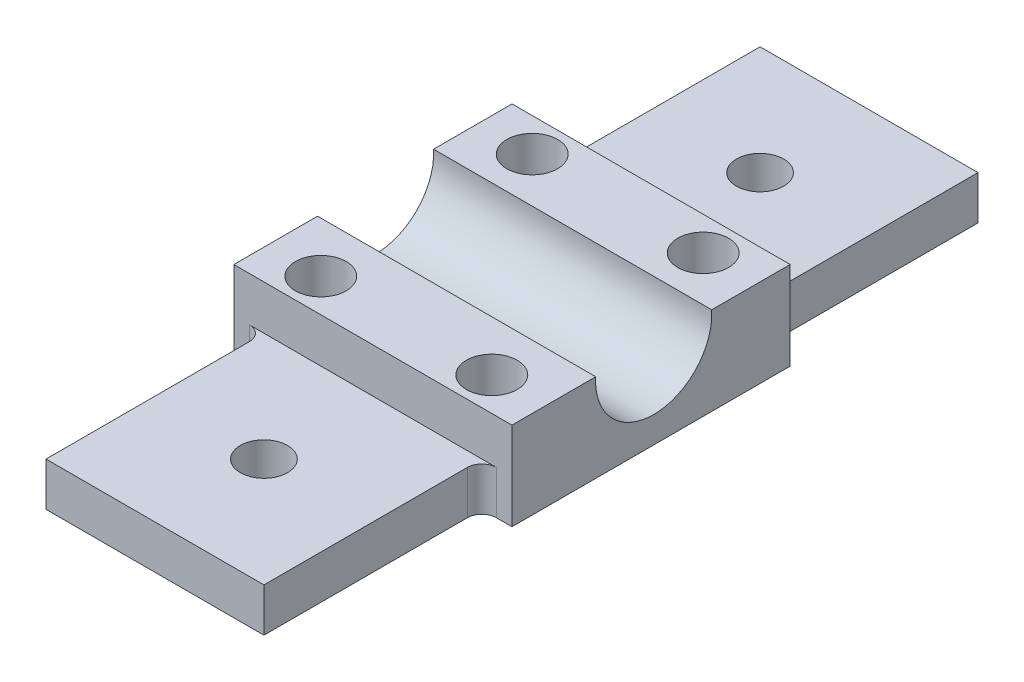
ISO-10303-21;
HEADER;
FILE_DESCRIPTION(('STEP AP214'),'2;1');
FILE_NAME('part.step','',(''),(''),'','','');
FILE_SCHEMA(('AUTOMOTIVE_DESIGN { 1 0 10303 214 1 1 1 1 }'));
ENDSEC;
DATA;
#1=APPLICATION_CONTEXT('core data for automotive mechanical design processes');
#2=APPLICATION_PROTOCOL_DEFINITION('international standard','automotive_design',2000,#1);
#3=PRODUCT_CONTEXT('',#1,'mechanical');
#4=PRODUCT('Part','Part','',(#3));
#5=PRODUCT_RELATED_PRODUCT_CATEGORY('part','',(#4));
#6=PRODUCT_DEFINITION_FORMATION('','',#4);
#7=PRODUCT_DEFINITION_CONTEXT('part definition',#1,'design');
#8=PRODUCT_DEFINITION('design','',#6,#7);
#9=PRODUCT_DEFINITION_SHAPE('','',#8);
#10=(LENGTH_UNIT() NAMED_UNIT(*) SI_UNIT(.MILLI.,.METRE.));
#11=(NAMED_UNIT(*) PLANE_ANGLE_UNIT() SI_UNIT($,.RADIAN.));
#12=(NAMED_UNIT(*) SI_UNIT($,.STERADIAN.) SOLID_ANGLE_UNIT());
#13=UNCERTAINTY_MEASURE_WITH_UNIT(LENGTH_MEASURE(1.E-05),#10,'distance_accuracy_value','');
#14=(GEOMETRIC_REPRESENTATION_CONTEXT(3) GLOBAL_UNCERTAINTY_ASSIGNED_CONTEXT((#13)) GLOBAL_UNIT_ASSIGNED_CONTEXT((#10,
#11,#12)) REPRESENTATION_CONTEXT('',''));
#15=CARTESIAN_POINT('',(0.,0.,0.));
#16=DIRECTION('',(0.,0.,1.));
#17=DIRECTION('',(1.,0.,0.));
#18=AXIS2_PLACEMENT_3D('',#15,#16,#17);
#19=CARTESIAN_POINT('',(-19.145,12.12,19.15));
#20=DIRECTION('',(0.,0.,-1.));
#21=DIRECTION('',(-1.,0.,0.));
#22=AXIS2_PLACEMENT_3D('',#19,#20,#21);
#23=PLANE('',#22);
#24=DIRECTION('',(-1.,0.,0.));
#25=VECTOR('',#24,1.);
#26=CARTESIAN_POINT('',(15.,6.,19.15));
#27=LINE('',#26,#25);
#28=CARTESIAN_POINT('',(17.,6.,19.15));
#29=VERTEX_POINT('',#28);
#30=CARTESIAN_POINT('',(-17.,6.,19.15));
#31=VERTEX_POINT('',#30);
#32=EDGE_CURVE('E190',#29,#31,#27,.T.);
#33=ORIENTED_EDGE('',*,*,#32,.F.);
#34=DIRECTION('',(0.,-1.,0.));
#35=VECTOR('',#34,1.);
#36=CARTESIAN_POINT('',(17.,0.,19.15));
#37=LINE('',#36,#35);
#38=CARTESIAN_POINT('',(17.,0.,19.15));
#39=VERTEX_POINT('',#38);
#40=EDGE_CURVE('E312',#29,#39,#37,.T.);
#41=ORIENTED_EDGE('',*,*,#40,.T.);
#42=DIRECTION('',(1.,0.,0.));
#43=VECTOR('',#42,1.);
#44=CARTESIAN_POINT('',(-19.145,0.,19.15));
#45=LINE('',#44,#43);
#46=CARTESIAN_POINT('',(19.145,0.,19.15));
#47=VERTEX_POINT('',#46);
#48=EDGE_CURVE('E294',#39,#47,#45,.T.);
#49=ORIENTED_EDGE('',*,*,#48,.T.);
#50=DIRECTION('',(0.,-1.,0.));
#51=VECTOR('',#50,1.);
#52=CARTESIAN_POINT('',(19.145,12.12,19.15));
#53=LINE('',#52,#51);
#54=CARTESIAN_POINT('',(19.145,12.12,19.15));
#55=VERTEX_POINT('',#54);
#56=EDGE_CURVE('E285',#55,#47,#53,.T.);
#57=ORIENTED_EDGE('',*,*,#56,.F.);
#58=DIRECTION('',(1.,0.,0.));
#59=VECTOR('',#58,1.);
#60=CARTESIAN_POINT('',(-19.145,12.12,19.15));
#61=LINE('',#60,#59);
#62=CARTESIAN_POINT('',(-19.145,12.12,19.15));
#63=VERTEX_POINT('',#62);
#64=EDGE_CURVE('E283',#63,#55,#61,.T.);
#65=ORIENTED_EDGE('',*,*,#64,.F.);
#66=DIRECTION('',(0.,-1.,0.));
#67=VECTOR('',#66,1.);
#68=CARTESIAN_POINT('',(-19.145,12.12,19.15));
#69=LINE('',#68,#67);
#70=CARTESIAN_POINT('',(-19.145,0.,19.15));
#71=VERTEX_POINT('',#70);
#72=EDGE_CURVE('E300',#63,#71,#69,.T.);
#73=ORIENTED_EDGE('',*,*,#72,.T.);
#74=CARTESIAN_POINT('',(-17.,0.,19.15));
#75=VERTEX_POINT('',#74);
#76=EDGE_CURVE('E295',#71,#75,#45,.T.);
#77=ORIENTED_EDGE('',*,*,#76,.T.);
#78=DIRECTION('',(0.,-1.,0.));
#79=VECTOR('',#78,1.);
#80=CARTESIAN_POINT('',(-17.,6.,19.15));
#81=LINE('',#80,#79);
#82=EDGE_CURVE('E309',#75,#31,#81,.F.);
#83=ORIENTED_EDGE('',*,*,#82,.T.);
#84=EDGE_LOOP('',(#33,#41,#49,#57,#65,#73,#77,#83));
#85=FACE_BOUND('',#84,.T.);
#86=ADVANCED_FACE('F43',(#85),#23,.F.);
#87=CARTESIAN_POINT('',(-19.145,12.12,-19.15));
#88=DIRECTION('',(0.,0.,1.));
#89=DIRECTION('',(1.,0.,0.));
#90=AXIS2_PLACEMENT_3D('',#87,#88,#89);
#91=PLANE('',#90);
#92=DIRECTION('',(-1.,0.,0.));
#93=VECTOR('',#92,1.);
#94=CARTESIAN_POINT('',(-19.145,0.,-19.15));
#95=LINE('',#94,#93);
#96=CARTESIAN_POINT('',(19.145,0.,-19.15));
#97=VERTEX_POINT('',#96);
#98=CARTESIAN_POINT('',(17.,0.,-19.15));
#99=VERTEX_POINT('',#98);
#100=EDGE_CURVE('E289',#97,#99,#95,.T.);
#101=ORIENTED_EDGE('',*,*,#100,.T.);
#102=DIRECTION('',(0.,-1.,0.));
#103=VECTOR('',#102,1.);
#104=CARTESIAN_POINT('',(17.,12.12,-19.15));
#105=LINE('',#104,#103);
#106=CARTESIAN_POINT('',(17.,6.,-19.15));
#107=VERTEX_POINT('',#106);
#108=EDGE_CURVE('E322',#99,#107,#105,.F.);
#109=ORIENTED_EDGE('',*,*,#108,.T.);
#110=DIRECTION('',(-1.,0.,0.));
#111=VECTOR('',#110,1.);
#112=CARTESIAN_POINT('',(15.,6.,-19.15));
#113=LINE('',#112,#111);
#114=CARTESIAN_POINT('',(-17.,6.,-19.15));
#115=VERTEX_POINT('',#114);
#116=EDGE_CURVE('E219',#107,#115,#113,.T.);
#117=ORIENTED_EDGE('',*,*,#116,.T.);
#118=DIRECTION('',(0.,-1.,0.));
#119=VECTOR('',#118,1.);
#120=CARTESIAN_POINT('',(-17.,12.12,-19.15));
#121=LINE('',#120,#119);
#122=CARTESIAN_POINT('',(-17.,0.,-19.15));
#123=VERTEX_POINT('',#122);
#124=EDGE_CURVE('E319',#115,#123,#121,.T.);
#125=ORIENTED_EDGE('',*,*,#124,.T.);
#126=CARTESIAN_POINT('',(-19.145,0.,-19.15));
#127=VERTEX_POINT('',#126);
#128=EDGE_CURVE('E288',#123,#127,#95,.T.);
#129=ORIENTED_EDGE('',*,*,#128,.T.);
#130=DIRECTION('',(0.,-1.,0.));
#131=VECTOR('',#130,1.);
#132=CARTESIAN_POINT('',(-19.145,12.12,-19.15));
#133=LINE('',#132,#131);
#134=CARTESIAN_POINT('',(-19.145,12.12,-19.15));
#135=VERTEX_POINT('',#134);
#136=EDGE_CURVE('E303',#135,#127,#133,.T.);
#137=ORIENTED_EDGE('',*,*,#136,.F.);
#138=DIRECTION('',(-1.,0.,0.));
#139=VECTOR('',#138,1.);
#140=CARTESIAN_POINT('',(-19.145,12.12,-19.15));
#141=LINE('',#140,#139);
#142=CARTESIAN_POINT('',(19.145,12.12,-19.15));
#143=VERTEX_POINT('',#142);
#144=EDGE_CURVE('E276',#143,#135,#141,.T.);
#145=ORIENTED_EDGE('',*,*,#144,.F.);
#146=DIRECTION('',(0.,-1.,0.));
#147=VECTOR('',#146,1.);
#148=CARTESIAN_POINT('',(19.145,12.12,-19.15));
#149=LINE('',#148,#147);
#150=EDGE_CURVE('E306',#143,#97,#149,.T.);
#151=ORIENTED_EDGE('',*,*,#150,.T.);
#152=EDGE_LOOP('',(#101,#109,#117,#125,#129,#137,#145,#151));
#153=FACE_BOUND('',#152,.T.);
#154=ADVANCED_FACE('F363',(#153),#91,.F.);
#155=CARTESIAN_POINT('',(0.,12.12,0.));
#156=DIRECTION('',(0.,1.,0.));
#157=DIRECTION('',(0.,0.,1.));
#158=AXIS2_PLACEMENT_3D('',#155,#156,#157);
#159=PLANE('',#158);
#160=CARTESIAN_POINT('',(-11.77,12.12,14.55));
#161=DIRECTION('',(0.,1.,0.));
#162=DIRECTION('',(0.,0.,1.));
#163=AXIS2_PLACEMENT_3D('',#160,#161,#162);
#164=CIRCLE('',#163,3.49999999999999);
#165=CARTESIAN_POINT('',(-11.77,12.12,18.05));
#166=VERTEX_POINT('',#165);
#167=EDGE_CURVE('E250',#166,#166,#164,.T.);
#168=ORIENTED_EDGE('',*,*,#167,.F.);
#169=EDGE_LOOP('',(#168));
#170=FACE_BOUND('',#169,.T.);
#171=CARTESIAN_POINT('',(11.77,12.12,14.55));
#172=DIRECTION('',(0.,1.,0.));
#173=DIRECTION('',(0.,0.,1.));
#174=AXIS2_PLACEMENT_3D('',#171,#172,#173);
#175=CIRCLE('',#174,3.49999999999999);
#176=CARTESIAN_POINT('',(11.77,12.12,18.05));
#177=VERTEX_POINT('',#176);
#178=EDGE_CURVE('E256',#177,#177,#175,.T.);
#179=ORIENTED_EDGE('',*,*,#178,.F.);
#180=EDGE_LOOP('',(#179));
#181=FACE_BOUND('',#180,.T.);
#182=DIRECTION('',(1.,0.,0.));
#183=VECTOR('',#182,1.);
#184=CARTESIAN_POINT('',(-19.145,12.12,7.62052552667431));
#185=LINE('',#184,#183);
#186=CARTESIAN_POINT('',(-19.145,12.12,7.62052552667431));
#187=VERTEX_POINT('',#186);
#188=CARTESIAN_POINT('',(19.145,12.12,7.62052552667431));
#189=VERTEX_POINT('',#188);
#190=EDGE_CURVE('E268',#187,#189,#185,.T.);
#191=ORIENTED_EDGE('',*,*,#190,.F.);
#192=DIRECTION('',(0.,0.,1.));
#193=VECTOR('',#192,1.);
#194=CARTESIAN_POINT('',(-19.145,12.12,-19.15));
#195=LINE('',#194,#193);
#196=EDGE_CURVE('E279',#187,#63,#195,.T.);
#197=ORIENTED_EDGE('',*,*,#196,.T.);
#198=ORIENTED_EDGE('',*,*,#64,.T.);
#199=DIRECTION('',(0.,0.,-1.));
#200=VECTOR('',#199,1.);
#201=CARTESIAN_POINT('',(19.145,12.12,-19.15));
#202=LINE('',#201,#200);
#203=EDGE_CURVE('E273',#55,#189,#202,.T.);
#204=ORIENTED_EDGE('',*,*,#203,.T.);
#205=EDGE_LOOP('',(#191,#197,#198,#204));
#206=FACE_BOUND('',#205,.T.);
#207=ADVANCED_FACE('F412',(#170,#181,#206),#159,.T.);
#208=CARTESIAN_POINT('',(19.145,12.12,-19.15));
#209=DIRECTION('',(-1.,0.,0.));
#210=DIRECTION('',(0.,0.,1.));
#211=AXIS2_PLACEMENT_3D('',#208,#209,#210);
#212=PLANE('',#211);
#213=CARTESIAN_POINT('',(19.145,12.12,-8.348193895997));
#214=VERTEX_POINT('',#213);
#215=EDGE_CURVE('E277',#214,#143,#202,.T.);
#216=ORIENTED_EDGE('',*,*,#215,.F.);
#217=CARTESIAN_POINT('',(19.145,11.62,-0.363834184661345));
#218=DIRECTION('',(1.,0.,0.));
#219=DIRECTION('',(0.,0.,-1.));
#220=AXIS2_PLACEMENT_3D('',#217,#218,#219);
#221=CIRCLE('',#220,8.);
#222=EDGE_CURVE('E262',#189,#214,#221,.T.);
#223=ORIENTED_EDGE('',*,*,#222,.F.);
#224=ORIENTED_EDGE('',*,*,#203,.F.);
#225=ORIENTED_EDGE('',*,*,#56,.T.);
#226=DIRECTION('',(0.,0.,-1.));
#227=VECTOR('',#226,1.);
#228=CARTESIAN_POINT('',(19.145,0.,-19.15));
#229=LINE('',#228,#227);
#230=EDGE_CURVE('E270',#47,#97,#229,.T.);
#231=ORIENTED_EDGE('',*,*,#230,.T.);
#232=ORIENTED_EDGE('',*,*,#150,.F.);
#233=EDGE_LOOP('',(#216,#223,#224,#225,#231,#232));
#234=FACE_BOUND('',#233,.T.);
#235=ADVANCED_FACE('F389',(#234),#212,.F.);
#236=CARTESIAN_POINT('',(-19.145,12.12,-19.15));
#237=DIRECTION('',(1.,0.,0.));
#238=DIRECTION('',(0.,0.,-1.));
#239=AXIS2_PLACEMENT_3D('',#236,#237,#238);
#240=PLANE('',#239);
#241=ORIENTED_EDGE('',*,*,#196,.F.);
#242=CARTESIAN_POINT('',(-19.145,11.62,-0.363834184661345));
#243=DIRECTION('',(1.,0.,0.));
#244=DIRECTION('',(0.,0.,-1.));
#245=AXIS2_PLACEMENT_3D('',#242,#243,#244);
#246=CIRCLE('',#245,8.);
#247=CARTESIAN_POINT('',(-19.145,12.12,-8.348193895997));
#248=VERTEX_POINT('',#247);
#249=EDGE_CURVE('E263',#187,#248,#246,.T.);
#250=ORIENTED_EDGE('',*,*,#249,.T.);
#251=EDGE_CURVE('E280',#135,#248,#195,.T.);
#252=ORIENTED_EDGE('',*,*,#251,.F.);
#253=ORIENTED_EDGE('',*,*,#136,.T.);
#254=DIRECTION('',(0.,0.,1.));
#255=VECTOR('',#254,1.);
#256=CARTESIAN_POINT('',(-19.145,0.,-19.15));
#257=LINE('',#256,#255);
#258=EDGE_CURVE('E292',#127,#71,#257,.T.);
#259=ORIENTED_EDGE('',*,*,#258,.T.);
#260=ORIENTED_EDGE('',*,*,#72,.F.);
#261=EDGE_LOOP('',(#241,#250,#252,#253,#259,#260));
#262=FACE_BOUND('',#261,.T.);
#263=ADVANCED_FACE('F359',(#262),#240,.F.);
#264=CARTESIAN_POINT('',(-11.77,12.12,-14.55));
#265=DIRECTION('',(0.,1.,0.));
#266=DIRECTION('',(0.,0.,1.));
#267=AXIS2_PLACEMENT_3D('',#264,#265,#266);
#268=CIRCLE('',#267,3.49999999999999);
#269=CARTESIAN_POINT('',(-11.77,12.12,-11.05));
#270=VERTEX_POINT('',#269);
#271=EDGE_CURVE('E236',#270,#270,#268,.T.);
#272=ORIENTED_EDGE('',*,*,#271,.F.);
#273=EDGE_LOOP('',(#272));
#274=FACE_BOUND('',#273,.T.);
#275=CARTESIAN_POINT('',(11.77,12.12,-14.55));
#276=DIRECTION('',(0.,1.,0.));
#277=DIRECTION('',(0.,0.,1.));
#278=AXIS2_PLACEMENT_3D('',#275,#276,#277);
#279=CIRCLE('',#278,3.49999999999999);
#280=CARTESIAN_POINT('',(11.77,12.12,-11.05));
#281=VERTEX_POINT('',#280);
#282=EDGE_CURVE('E244',#281,#281,#279,.T.);
#283=ORIENTED_EDGE('',*,*,#282,.F.);
#284=EDGE_LOOP('',(#283));
#285=FACE_BOUND('',#284,.T.);
#286=DIRECTION('',(1.,0.,0.));
#287=VECTOR('',#286,1.);
#288=CARTESIAN_POINT('',(-19.145,12.12,-8.348193895997));
#289=LINE('',#288,#287);
#290=EDGE_CURVE('E266',#248,#214,#289,.T.);
#291=ORIENTED_EDGE('',*,*,#290,.T.);
#292=ORIENTED_EDGE('',*,*,#215,.T.);
#293=ORIENTED_EDGE('',*,*,#144,.T.);
#294=ORIENTED_EDGE('',*,*,#251,.T.);
#295=EDGE_LOOP('',(#291,#292,#293,#294));
#296=FACE_BOUND('',#295,.T.);
#297=ADVANCED_FACE('F418',(#274,#285,#296),#159,.T.);
#298=CARTESIAN_POINT('',(0.,0.,0.));
#299=DIRECTION('',(0.,1.,0.));
#300=DIRECTION('',(0.,0.,1.));
#301=AXIS2_PLACEMENT_3D('',#298,#299,#300);
#302=PLANE('',#301);
#303=CARTESIAN_POINT('',(-11.77,0.,-14.55));
#304=DIRECTION('',(0.,1.,0.));
#305=DIRECTION('',(0.,0.,1.));
#306=AXIS2_PLACEMENT_3D('',#303,#304,#305);
#307=CIRCLE('',#306,3.49999999999999);
#308=CARTESIAN_POINT('',(-11.77,0.,-11.05));
#309=VERTEX_POINT('',#308);
#310=EDGE_CURVE('E241',#309,#309,#307,.T.);
#311=ORIENTED_EDGE('',*,*,#310,.T.);
#312=EDGE_LOOP('',(#311));
#313=FACE_BOUND('',#312,.T.);
#314=CARTESIAN_POINT('',(11.77,0.,-14.55));
#315=DIRECTION('',(0.,1.,0.));
#316=DIRECTION('',(0.,0.,1.));
#317=AXIS2_PLACEMENT_3D('',#314,#315,#316);
#318=CIRCLE('',#317,3.49999999999999);
#319=CARTESIAN_POINT('',(11.77,0.,-11.05));
#320=VERTEX_POINT('',#319);
#321=EDGE_CURVE('E247',#320,#320,#318,.T.);
#322=ORIENTED_EDGE('',*,*,#321,.T.);
#323=EDGE_LOOP('',(#322));
#324=FACE_BOUND('',#323,.T.);
#325=CARTESIAN_POINT('',(-11.77,0.,14.55));
#326=DIRECTION('',(0.,1.,0.));
#327=DIRECTION('',(0.,0.,1.));
#328=AXIS2_PLACEMENT_3D('',#325,#326,#327);
#329=CIRCLE('',#328,3.49999999999999);
#330=CARTESIAN_POINT('',(-11.77,0.,18.05));
#331=VERTEX_POINT('',#330);
#332=EDGE_CURVE('E253',#331,#331,#329,.T.);
#333=ORIENTED_EDGE('',*,*,#332,.T.);
#334=EDGE_LOOP('',(#333));
#335=FACE_BOUND('',#334,.T.);
#336=CARTESIAN_POINT('',(11.77,0.,14.55));
#337=DIRECTION('',(0.,1.,0.));
#338=DIRECTION('',(0.,0.,1.));
#339=AXIS2_PLACEMENT_3D('',#336,#337,#338);
#340=CIRCLE('',#339,3.49999999999999);
#341=CARTESIAN_POINT('',(11.77,0.,18.05));
#342=VERTEX_POINT('',#341);
#343=EDGE_CURVE('E259',#342,#342,#340,.T.);
#344=ORIENTED_EDGE('',*,*,#343,.T.);
#345=EDGE_LOOP('',(#344));
#346=FACE_BOUND('',#345,.T.);
#347=ORIENTED_EDGE('',*,*,#230,.F.);
#348=ORIENTED_EDGE('',*,*,#48,.F.);
#349=CARTESIAN_POINT('',(17.,0.,21.15));
#350=DIRECTION('',(0.,1.,0.));
#351=DIRECTION('',(0.,0.,1.));
#352=AXIS2_PLACEMENT_3D('',#349,#350,#351);
#353=CIRCLE('',#352,2.);
#354=CARTESIAN_POINT('',(15.,0.,21.15));
#355=VERTEX_POINT('',#354);
#356=EDGE_CURVE('E329',#39,#355,#353,.T.);
#357=ORIENTED_EDGE('',*,*,#356,.T.);
#358=DIRECTION('',(0.,0.,-1.));
#359=VECTOR('',#358,1.);
#360=CARTESIAN_POINT('',(15.,0.,19.15));
#361=LINE('',#360,#359);
#362=CARTESIAN_POINT('',(15.,0.,49.15));
#363=VERTEX_POINT('',#362);
#364=EDGE_CURVE('E204',#363,#355,#361,.T.);
#365=ORIENTED_EDGE('',*,*,#364,.F.);
#366=DIRECTION('',(1.,0.,0.));
#367=VECTOR('',#366,1.);
#368=CARTESIAN_POINT('',(15.,0.,49.15));
#369=LINE('',#368,#367);
#370=CARTESIAN_POINT('',(-15.,0.,49.15));
#371=VERTEX_POINT('',#370);
#372=EDGE_CURVE('E185',#371,#363,#369,.T.);
#373=ORIENTED_EDGE('',*,*,#372,.F.);
#374=DIRECTION('',(0.,0.,1.));
#375=VECTOR('',#374,1.);
#376=CARTESIAN_POINT('',(-15.,0.,19.15));
#377=LINE('',#376,#375);
#378=CARTESIAN_POINT('',(-15.,0.,21.15));
#379=VERTEX_POINT('',#378);
#380=EDGE_CURVE('E195',#379,#371,#377,.T.);
#381=ORIENTED_EDGE('',*,*,#380,.F.);
#382=CARTESIAN_POINT('',(-17.,0.,21.15));
#383=DIRECTION('',(0.,1.,0.));
#384=DIRECTION('',(0.,0.,1.));
#385=AXIS2_PLACEMENT_3D('',#382,#383,#384);
#386=CIRCLE('',#385,2.);
#387=EDGE_CURVE('E337',#379,#75,#386,.T.);
#388=ORIENTED_EDGE('',*,*,#387,.T.);
#389=ORIENTED_EDGE('',*,*,#76,.F.);
#390=ORIENTED_EDGE('',*,*,#258,.F.);
#391=ORIENTED_EDGE('',*,*,#128,.F.);
#392=CARTESIAN_POINT('',(-17.,0.,-21.15));
#393=DIRECTION('',(0.,1.,0.));
#394=DIRECTION('',(0.,0.,1.));
#395=AXIS2_PLACEMENT_3D('',#392,#393,#394);
#396=CIRCLE('',#395,2.);
#397=CARTESIAN_POINT('',(-15.,0.,-21.15));
#398=VERTEX_POINT('',#397);
#399=EDGE_CURVE('E51',#123,#398,#396,.T.);
#400=ORIENTED_EDGE('',*,*,#399,.T.);
#401=DIRECTION('',(0.,0.,-1.));
#402=VECTOR('',#401,1.);
#403=CARTESIAN_POINT('',(-15.,0.,-19.15));
#404=LINE('',#403,#402);
#405=CARTESIAN_POINT('',(-15.,0.,-49.15));
#406=VERTEX_POINT('',#405);
#407=EDGE_CURVE('E230',#398,#406,#404,.T.);
#408=ORIENTED_EDGE('',*,*,#407,.T.);
#409=DIRECTION('',(1.,0.,0.));
#410=VECTOR('',#409,1.);
#411=CARTESIAN_POINT('',(15.,0.,-49.15));
#412=LINE('',#411,#410);
#413=CARTESIAN_POINT('',(15.,0.,-49.15));
#414=VERTEX_POINT('',#413);
#415=EDGE_CURVE('E220',#406,#414,#412,.T.);
#416=ORIENTED_EDGE('',*,*,#415,.T.);
#417=DIRECTION('',(0.,0.,1.));
#418=VECTOR('',#417,1.);
#419=CARTESIAN_POINT('',(15.,0.,-19.15));
#420=LINE('',#419,#418);
#421=CARTESIAN_POINT('',(15.,0.,-21.15));
#422=VERTEX_POINT('',#421);
#423=EDGE_CURVE('E213',#414,#422,#420,.T.);
#424=ORIENTED_EDGE('',*,*,#423,.T.);
#425=CARTESIAN_POINT('',(17.,0.,-21.15));
#426=DIRECTION('',(0.,1.,0.));
#427=DIRECTION('',(0.,0.,1.));
#428=AXIS2_PLACEMENT_3D('',#425,#426,#427);
#429=CIRCLE('',#428,2.);
#430=EDGE_CURVE('E333',#422,#99,#429,.T.);
#431=ORIENTED_EDGE('',*,*,#430,.T.);
#432=ORIENTED_EDGE('',*,*,#100,.F.);
#433=EDGE_LOOP('',(#347,#348,#357,#365,#373,#381,#388,#389,#390,#391,#400,#408,#416,#424,#431,#432));
#434=FACE_BOUND('',#433,.T.);
#435=CARTESIAN_POINT('',(0.,0.,-34.15));
#436=DIRECTION('',(0.,-1.,0.));
#437=DIRECTION('',(0.,0.,-1.));
#438=AXIS2_PLACEMENT_3D('',#435,#436,#437);
#439=CIRCLE('',#438,3.25);
#440=CARTESIAN_POINT('',(0.,0.,-37.4));
#441=VERTEX_POINT('',#440);
#442=EDGE_CURVE('E208',#441,#441,#439,.T.);
#443=ORIENTED_EDGE('',*,*,#442,.F.);
#444=EDGE_LOOP('',(#443));
#445=FACE_BOUND('',#444,.T.);
#446=CARTESIAN_POINT('',(0.,0.,34.15));
#447=DIRECTION('',(0.,1.,0.));
#448=DIRECTION('',(0.,0.,1.));
#449=AXIS2_PLACEMENT_3D('',#446,#447,#448);
#450=CIRCLE('',#449,3.25);
#451=CARTESIAN_POINT('',(0.,0.,37.4));
#452=VERTEX_POINT('',#451);
#453=EDGE_CURVE('E199',#452,#452,#450,.T.);
#454=ORIENTED_EDGE('',*,*,#453,.T.);
#455=EDGE_LOOP('',(#454));
#456=FACE_BOUND('',#455,.T.);
#457=ADVANCED_FACE('F350',(#313,#324,#335,#346,#434,#445,#456),#302,.F.);
#458=CARTESIAN_POINT('',(-19.145,11.62,-0.363834184661345));
#459=DIRECTION('',(1.,0.,0.));
#460=DIRECTION('',(0.,0.,-1.));
#461=AXIS2_PLACEMENT_3D('',#458,#459,#460);
#462=CYLINDRICAL_SURFACE('',#461,8.);
#463=ORIENTED_EDGE('',*,*,#222,.T.);
#464=ORIENTED_EDGE('',*,*,#290,.F.);
#465=ORIENTED_EDGE('',*,*,#249,.F.);
#466=ORIENTED_EDGE('',*,*,#190,.T.);
#467=EDGE_LOOP('',(#463,#464,#465,#466));
#468=FACE_BOUND('',#467,.T.);
#469=ADVANCED_FACE('F437',(#468),#462,.F.);
#470=CARTESIAN_POINT('',(11.77,12.12,14.55));
#471=DIRECTION('',(0.,1.,0.));
#472=DIRECTION('',(0.,0.,1.));
#473=AXIS2_PLACEMENT_3D('',#470,#471,#472);
#474=CYLINDRICAL_SURFACE('',#473,3.49999999999999);
#475=ORIENTED_EDGE('',*,*,#343,.F.);
#476=EDGE_LOOP('',(#475));
#477=FACE_BOUND('',#476,.T.);
#478=ORIENTED_EDGE('',*,*,#178,.T.);
#479=EDGE_LOOP('',(#478));
#480=FACE_BOUND('',#479,.T.);
#481=ADVANCED_FACE('F447',(#477,#480),#474,.F.);
#482=CARTESIAN_POINT('',(-11.77,12.12,14.55));
#483=DIRECTION('',(0.,1.,0.));
#484=DIRECTION('',(0.,0.,1.));
#485=AXIS2_PLACEMENT_3D('',#482,#483,#484);
#486=CYLINDRICAL_SURFACE('',#485,3.49999999999999);
#487=ORIENTED_EDGE('',*,*,#332,.F.);
#488=EDGE_LOOP('',(#487));
#489=FACE_BOUND('',#488,.T.);
#490=ORIENTED_EDGE('',*,*,#167,.T.);
#491=EDGE_LOOP('',(#490));
#492=FACE_BOUND('',#491,.T.);
#493=ADVANCED_FACE('F452',(#489,#492),#486,.F.);
#494=CARTESIAN_POINT('',(11.77,12.12,-14.55));
#495=DIRECTION('',(0.,1.,0.));
#496=DIRECTION('',(0.,0.,1.));
#497=AXIS2_PLACEMENT_3D('',#494,#495,#496);
#498=CYLINDRICAL_SURFACE('',#497,3.49999999999999);
#499=ORIENTED_EDGE('',*,*,#321,.F.);
#500=EDGE_LOOP('',(#499));
#501=FACE_BOUND('',#500,.T.);
#502=ORIENTED_EDGE('',*,*,#282,.T.);
#503=EDGE_LOOP('',(#502));
#504=FACE_BOUND('',#503,.T.);
#505=ADVANCED_FACE('F458',(#501,#504),#498,.F.);
#506=CARTESIAN_POINT('',(-11.77,12.12,-14.55));
#507=DIRECTION('',(0.,1.,0.));
#508=DIRECTION('',(0.,0.,1.));
#509=AXIS2_PLACEMENT_3D('',#506,#507,#508);
#510=CYLINDRICAL_SURFACE('',#509,3.49999999999999);
#511=ORIENTED_EDGE('',*,*,#310,.F.);
#512=EDGE_LOOP('',(#511));
#513=FACE_BOUND('',#512,.T.);
#514=ORIENTED_EDGE('',*,*,#271,.T.);
#515=EDGE_LOOP('',(#514));
#516=FACE_BOUND('',#515,.T.);
#517=ADVANCED_FACE('F462',(#513,#516),#510,.F.);
#518=CARTESIAN_POINT('',(15.,6.,-19.15));
#519=DIRECTION('',(1.,0.,0.));
#520=DIRECTION('',(0.,0.,-1.));
#521=AXIS2_PLACEMENT_3D('',#518,#519,#520);
#522=PLANE('',#521);
#523=DIRECTION('',(0.,0.,1.));
#524=VECTOR('',#523,1.);
#525=CARTESIAN_POINT('',(15.,6.,-19.15));
#526=LINE('',#525,#524);
#527=CARTESIAN_POINT('',(15.,6.,-49.15));
#528=VERTEX_POINT('',#527);
#529=CARTESIAN_POINT('',(15.,6.,-21.15));
#530=VERTEX_POINT('',#529);
#531=EDGE_CURVE('E216',#528,#530,#526,.T.);
#532=ORIENTED_EDGE('',*,*,#531,.T.);
#533=DIRECTION('',(0.,-1.,0.));
#534=VECTOR('',#533,1.);
#535=CARTESIAN_POINT('',(15.,6.,-21.15));
#536=LINE('',#535,#534);
#537=EDGE_CURVE('E316',#530,#422,#536,.T.);
#538=ORIENTED_EDGE('',*,*,#537,.T.);
#539=ORIENTED_EDGE('',*,*,#423,.F.);
#540=DIRECTION('',(0.,-1.,0.));
#541=VECTOR('',#540,1.);
#542=CARTESIAN_POINT('',(15.,6.,-49.15));
#543=LINE('',#542,#541);
#544=EDGE_CURVE('E234',#528,#414,#543,.T.);
#545=ORIENTED_EDGE('',*,*,#544,.F.);
#546=EDGE_LOOP('',(#532,#538,#539,#545));
#547=FACE_BOUND('',#546,.T.);
#548=ADVANCED_FACE('F379',(#547),#522,.T.);
#549=CARTESIAN_POINT('',(15.,6.,-49.15));
#550=DIRECTION('',(0.,0.,-1.));
#551=DIRECTION('',(-1.,0.,0.));
#552=AXIS2_PLACEMENT_3D('',#549,#550,#551);
#553=PLANE('',#552);
#554=ORIENTED_EDGE('',*,*,#415,.F.);
#555=DIRECTION('',(0.,-1.,0.));
#556=VECTOR('',#555,1.);
#557=CARTESIAN_POINT('',(-15.,6.,-49.15));
#558=LINE('',#557,#556);
#559=CARTESIAN_POINT('',(-15.,6.,-49.15));
#560=VERTEX_POINT('',#559);
#561=EDGE_CURVE('E227',#560,#406,#558,.T.);
#562=ORIENTED_EDGE('',*,*,#561,.F.);
#563=DIRECTION('',(1.,0.,0.));
#564=VECTOR('',#563,1.);
#565=CARTESIAN_POINT('',(15.,6.,-49.15));
#566=LINE('',#565,#564);
#567=EDGE_CURVE('E224',#560,#528,#566,.T.);
#568=ORIENTED_EDGE('',*,*,#567,.T.);
#569=ORIENTED_EDGE('',*,*,#544,.T.);
#570=EDGE_LOOP('',(#554,#562,#568,#569));
#571=FACE_BOUND('',#570,.T.);
#572=ADVANCED_FACE('F376',(#571),#553,.T.);
#573=CARTESIAN_POINT('',(-15.,6.,-19.15));
#574=DIRECTION('',(-1.,0.,0.));
#575=DIRECTION('',(0.,0.,1.));
#576=AXIS2_PLACEMENT_3D('',#573,#574,#575);
#577=PLANE('',#576);
#578=ORIENTED_EDGE('',*,*,#407,.F.);
#579=DIRECTION('',(0.,-1.,0.));
#580=VECTOR('',#579,1.);
#581=CARTESIAN_POINT('',(-15.,6.,-21.15));
#582=LINE('',#581,#580);
#583=CARTESIAN_POINT('',(-15.,6.,-21.15));
#584=VERTEX_POINT('',#583);
#585=EDGE_CURVE('E58',#398,#584,#582,.F.);
#586=ORIENTED_EDGE('',*,*,#585,.T.);
#587=DIRECTION('',(0.,0.,-1.));
#588=VECTOR('',#587,1.);
#589=CARTESIAN_POINT('',(-15.,6.,-19.15));
#590=LINE('',#589,#588);
#591=EDGE_CURVE('E222',#584,#560,#590,.T.);
#592=ORIENTED_EDGE('',*,*,#591,.T.);
#593=ORIENTED_EDGE('',*,*,#561,.T.);
#594=EDGE_LOOP('',(#578,#586,#592,#593));
#595=FACE_BOUND('',#594,.T.);
#596=ADVANCED_FACE('F373',(#595),#577,.T.);
#597=CARTESIAN_POINT('',(0.,6.,0.));
#598=DIRECTION('',(0.,1.,0.));
#599=DIRECTION('',(0.,0.,1.));
#600=AXIS2_PLACEMENT_3D('',#597,#598,#599);
#601=PLANE('',#600);
#602=CARTESIAN_POINT('',(0.,6.,-34.15));
#603=DIRECTION('',(0.,-1.,0.));
#604=DIRECTION('',(0.,0.,-1.));
#605=AXIS2_PLACEMENT_3D('',#602,#603,#604);
#606=CIRCLE('',#605,3.25);
#607=CARTESIAN_POINT('',(0.,6.,-37.4));
#608=VERTEX_POINT('',#607);
#609=EDGE_CURVE('E210',#608,#608,#606,.T.);
#610=ORIENTED_EDGE('',*,*,#609,.T.);
#611=EDGE_LOOP('',(#610));
#612=FACE_BOUND('',#611,.T.);
#613=ORIENTED_EDGE('',*,*,#531,.F.);
#614=ORIENTED_EDGE('',*,*,#567,.F.);
#615=ORIENTED_EDGE('',*,*,#591,.F.);
#616=CARTESIAN_POINT('',(-17.,6.,-21.15));
#617=DIRECTION('',(0.,1.,0.));
#618=DIRECTION('',(0.,0.,1.));
#619=AXIS2_PLACEMENT_3D('',#616,#617,#618);
#620=CIRCLE('',#619,2.);
#621=EDGE_CURVE('E11',#584,#115,#620,.F.);
#622=ORIENTED_EDGE('',*,*,#621,.T.);
#623=ORIENTED_EDGE('',*,*,#116,.F.);
#624=CARTESIAN_POINT('',(17.,6.,-21.15));
#625=DIRECTION('',(0.,1.,0.));
#626=DIRECTION('',(0.,0.,1.));
#627=AXIS2_PLACEMENT_3D('',#624,#625,#626);
#628=CIRCLE('',#627,2.);
#629=EDGE_CURVE('E335',#107,#530,#628,.F.);
#630=ORIENTED_EDGE('',*,*,#629,.T.);
#631=EDGE_LOOP('',(#613,#614,#615,#622,#623,#630));
#632=FACE_BOUND('',#631,.T.);
#633=ADVANCED_FACE('F370',(#612,#632),#601,.T.);
#634=CARTESIAN_POINT('',(0.,6.,-34.15));
#635=DIRECTION('',(0.,-1.,0.));
#636=DIRECTION('',(0.,0.,-1.));
#637=AXIS2_PLACEMENT_3D('',#634,#635,#636);
#638=CYLINDRICAL_SURFACE('',#637,3.25);
#639=ORIENTED_EDGE('',*,*,#609,.F.);
#640=EDGE_LOOP('',(#639));
#641=FACE_BOUND('',#640,.T.);
#642=ORIENTED_EDGE('',*,*,#442,.T.);
#643=EDGE_LOOP('',(#642));
#644=FACE_BOUND('',#643,.T.);
#645=ADVANCED_FACE('F474',(#641,#644),#638,.F.);
#646=CARTESIAN_POINT('',(0.,6.,0.));
#647=DIRECTION('',(0.,1.,0.));
#648=DIRECTION('',(0.,0.,-1.));
#649=AXIS2_PLACEMENT_3D('',#646,#647,#648);
#650=PLANE('',#649);
#651=DIRECTION('',(0.,0.,-1.));
#652=VECTOR('',#651,1.);
#653=CARTESIAN_POINT('',(15.,6.,19.15));
#654=LINE('',#653,#652);
#655=CARTESIAN_POINT('',(15.,6.,49.15));
#656=VERTEX_POINT('',#655);
#657=CARTESIAN_POINT('',(15.,6.,21.15));
#658=VERTEX_POINT('',#657);
#659=EDGE_CURVE('E173',#656,#658,#654,.T.);
#660=ORIENTED_EDGE('',*,*,#659,.T.);
#661=CARTESIAN_POINT('',(17.,6.,21.15));
#662=DIRECTION('',(0.,1.,0.));
#663=DIRECTION('',(0.,0.,1.));
#664=AXIS2_PLACEMENT_3D('',#661,#662,#663);
#665=CIRCLE('',#664,2.);
#666=EDGE_CURVE('E331',#658,#29,#665,.F.);
#667=ORIENTED_EDGE('',*,*,#666,.T.);
#668=ORIENTED_EDGE('',*,*,#32,.T.);
#669=CARTESIAN_POINT('',(-17.,6.,21.15));
#670=DIRECTION('',(0.,1.,0.));
#671=DIRECTION('',(0.,0.,1.));
#672=AXIS2_PLACEMENT_3D('',#669,#670,#671);
#673=CIRCLE('',#672,2.);
#674=CARTESIAN_POINT('',(-15.,6.,21.15));
#675=VERTEX_POINT('',#674);
#676=EDGE_CURVE('E339',#31,#675,#673,.F.);
#677=ORIENTED_EDGE('',*,*,#676,.T.);
#678=DIRECTION('',(0.,0.,1.));
#679=VECTOR('',#678,1.);
#680=CARTESIAN_POINT('',(-15.,6.,19.15));
#681=LINE('',#680,#679);
#682=CARTESIAN_POINT('',(-15.,6.,49.15));
#683=VERTEX_POINT('',#682);
#684=EDGE_CURVE('E176',#675,#683,#681,.T.);
#685=ORIENTED_EDGE('',*,*,#684,.T.);
#686=DIRECTION('',(1.,0.,0.));
#687=VECTOR('',#686,1.);
#688=CARTESIAN_POINT('',(15.,6.,49.15));
#689=LINE('',#688,#687);
#690=EDGE_CURVE('E167',#683,#656,#689,.T.);
#691=ORIENTED_EDGE('',*,*,#690,.T.);
#692=EDGE_LOOP('',(#660,#667,#668,#677,#685,#691));
#693=FACE_BOUND('',#692,.T.);
#694=CARTESIAN_POINT('',(0.,6.,34.15));
#695=DIRECTION('',(0.,1.,0.));
#696=DIRECTION('',(0.,0.,1.));
#697=AXIS2_PLACEMENT_3D('',#694,#695,#696);
#698=CIRCLE('',#697,3.25);
#699=CARTESIAN_POINT('',(0.,6.,37.4));
#700=VERTEX_POINT('',#699);
#701=EDGE_CURVE('E206',#700,#700,#698,.T.);
#702=ORIENTED_EDGE('',*,*,#701,.F.);
#703=EDGE_LOOP('',(#702));
#704=FACE_BOUND('',#703,.T.);
#705=ADVANCED_FACE('F169',(#693,#704),#650,.T.);
#706=CARTESIAN_POINT('',(15.,6.,19.15));
#707=DIRECTION('',(-1.,0.,0.));
#708=DIRECTION('',(0.,0.,1.));
#709=AXIS2_PLACEMENT_3D('',#706,#707,#708);
#710=PLANE('',#709);
#711=ORIENTED_EDGE('',*,*,#364,.T.);
#712=DIRECTION('',(0.,-1.,0.));
#713=VECTOR('',#712,1.);
#714=CARTESIAN_POINT('',(15.,6.,21.15));
#715=LINE('',#714,#713);
#716=EDGE_CURVE('E194',#355,#658,#715,.F.);
#717=ORIENTED_EDGE('',*,*,#716,.T.);
#718=ORIENTED_EDGE('',*,*,#659,.F.);
#719=DIRECTION('',(0.,-1.,0.));
#720=VECTOR('',#719,1.);
#721=CARTESIAN_POINT('',(15.,6.,49.15));
#722=LINE('',#721,#720);
#723=EDGE_CURVE('E182',#656,#363,#722,.T.);
#724=ORIENTED_EDGE('',*,*,#723,.T.);
#725=EDGE_LOOP('',(#711,#717,#718,#724));
#726=FACE_BOUND('',#725,.T.);
#727=ADVANCED_FACE('F192',(#726),#710,.F.);
#728=CARTESIAN_POINT('',(-15.,6.,19.15));
#729=DIRECTION('',(1.,0.,0.));
#730=DIRECTION('',(0.,0.,-1.));
#731=AXIS2_PLACEMENT_3D('',#728,#729,#730);
#732=PLANE('',#731);
#733=ORIENTED_EDGE('',*,*,#684,.F.);
#734=DIRECTION('',(0.,-1.,0.));
#735=VECTOR('',#734,1.);
#736=CARTESIAN_POINT('',(-15.,0.,21.15));
#737=LINE('',#736,#735);
#738=EDGE_CURVE('E325',#675,#379,#737,.T.);
#739=ORIENTED_EDGE('',*,*,#738,.T.);
#740=ORIENTED_EDGE('',*,*,#380,.T.);
#741=DIRECTION('',(0.,-1.,0.));
#742=VECTOR('',#741,1.);
#743=CARTESIAN_POINT('',(-15.,6.,49.15));
#744=LINE('',#743,#742);
#745=EDGE_CURVE('E189',#683,#371,#744,.T.);
#746=ORIENTED_EDGE('',*,*,#745,.F.);
#747=EDGE_LOOP('',(#733,#739,#740,#746));
#748=FACE_BOUND('',#747,.T.);
#749=ADVANCED_FACE('F345',(#748),#732,.F.);
#750=CARTESIAN_POINT('',(15.,6.,49.15));
#751=DIRECTION('',(0.,0.,-1.));
#752=DIRECTION('',(-1.,0.,0.));
#753=AXIS2_PLACEMENT_3D('',#750,#751,#752);
#754=PLANE('',#753);
#755=ORIENTED_EDGE('',*,*,#372,.T.);
#756=ORIENTED_EDGE('',*,*,#723,.F.);
#757=ORIENTED_EDGE('',*,*,#690,.F.);
#758=ORIENTED_EDGE('',*,*,#745,.T.);
#759=EDGE_LOOP('',(#755,#756,#757,#758));
#760=FACE_BOUND('',#759,.T.);
#761=ADVANCED_FACE('F183',(#760),#754,.F.);
#762=CARTESIAN_POINT('',(0.,6.,34.15));
#763=DIRECTION('',(0.,-1.,0.));
#764=DIRECTION('',(0.,0.,-1.));
#765=AXIS2_PLACEMENT_3D('',#762,#763,#764);
#766=CYLINDRICAL_SURFACE('',#765,3.25);
#767=ORIENTED_EDGE('',*,*,#701,.T.);
#768=EDGE_LOOP('',(#767));
#769=FACE_BOUND('',#768,.T.);
#770=ORIENTED_EDGE('',*,*,#453,.F.);
#771=EDGE_LOOP('',(#770));
#772=FACE_BOUND('',#771,.T.);
#773=ADVANCED_FACE('F396',(#769,#772),#766,.F.);
#774=CARTESIAN_POINT('',(17.,12.12,21.15));
#775=DIRECTION('',(0.,1.,0.));
#776=DIRECTION('',(0.,0.,1.));
#777=AXIS2_PLACEMENT_3D('',#774,#775,#776);
#778=CYLINDRICAL_SURFACE('',#777,2.);
#779=ORIENTED_EDGE('',*,*,#666,.F.);
#780=ORIENTED_EDGE('',*,*,#716,.F.);
#781=ORIENTED_EDGE('',*,*,#356,.F.);
#782=ORIENTED_EDGE('',*,*,#40,.F.);
#783=EDGE_LOOP('',(#779,#780,#781,#782));
#784=FACE_BOUND('',#783,.T.);
#785=ADVANCED_FACE('F394',(#784),#778,.F.);
#786=CARTESIAN_POINT('',(17.,6.,-21.15));
#787=DIRECTION('',(0.,-1.,0.));
#788=DIRECTION('',(0.,0.,-1.));
#789=AXIS2_PLACEMENT_3D('',#786,#787,#788);
#790=CYLINDRICAL_SURFACE('',#789,2.);
#791=ORIENTED_EDGE('',*,*,#629,.F.);
#792=ORIENTED_EDGE('',*,*,#108,.F.);
#793=ORIENTED_EDGE('',*,*,#430,.F.);
#794=ORIENTED_EDGE('',*,*,#537,.F.);
#795=EDGE_LOOP('',(#791,#792,#793,#794));
#796=FACE_BOUND('',#795,.T.);
#797=ADVANCED_FACE('F383',(#796),#790,.F.);
#798=CARTESIAN_POINT('',(-17.,6.,21.15));
#799=DIRECTION('',(0.,1.,0.));
#800=DIRECTION('',(0.,0.,1.));
#801=AXIS2_PLACEMENT_3D('',#798,#799,#800);
#802=CYLINDRICAL_SURFACE('',#801,2.);
#803=ORIENTED_EDGE('',*,*,#676,.F.);
#804=ORIENTED_EDGE('',*,*,#82,.F.);
#805=ORIENTED_EDGE('',*,*,#387,.F.);
#806=ORIENTED_EDGE('',*,*,#738,.F.);
#807=EDGE_LOOP('',(#803,#804,#805,#806));
#808=FACE_BOUND('',#807,.T.);
#809=ADVANCED_FACE('F347',(#808),#802,.F.);
#810=CARTESIAN_POINT('',(-17.,12.12,-21.15));
#811=DIRECTION('',(0.,-1.,0.));
#812=DIRECTION('',(0.,0.,-1.));
#813=AXIS2_PLACEMENT_3D('',#810,#811,#812);
#814=CYLINDRICAL_SURFACE('',#813,2.);
#815=ORIENTED_EDGE('',*,*,#621,.F.);
#816=ORIENTED_EDGE('',*,*,#585,.F.);
#817=ORIENTED_EDGE('',*,*,#399,.F.);
#818=ORIENTED_EDGE('',*,*,#124,.F.);
#819=EDGE_LOOP('',(#815,#816,#817,#818));
#820=FACE_BOUND('',#819,.T.);
#821=ADVANCED_FACE('F45',(#820),#814,.F.);
#822=CLOSED_SHELL('',(#86,#154,#207,#235,#263,#297,#457,#469,#481,#493,#505,#517,#548,#572,#596,
#633,#645,#705,#727,#749,#761,#773,#785,#797,#809,#821));
#823=MANIFOLD_SOLID_BREP('B2',#822);
#824=ADVANCED_BREP_SHAPE_REPRESENTATION('',(#18,#823),#14);
#825=SHAPE_DEFINITION_REPRESENTATION(#9,#824);
ENDSEC;
END-ISO-10303-21;
